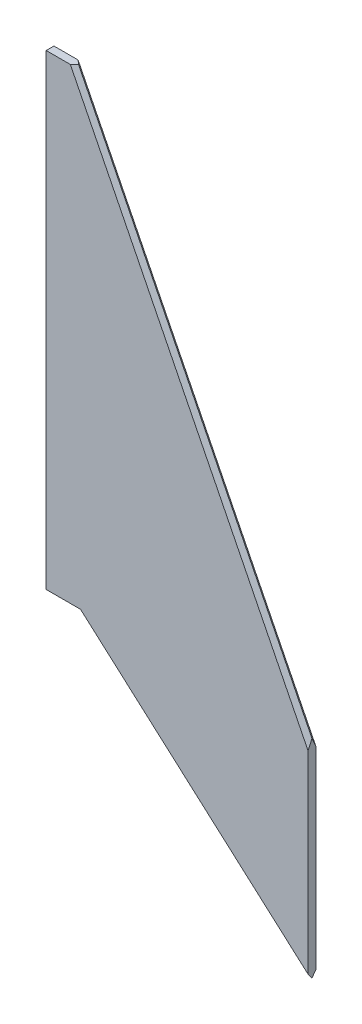
ISO-10303-21;
HEADER;
FILE_DESCRIPTION(('STEP AP214'),'2;1');
FILE_NAME('part.step','',(''),(''),'','','');
FILE_SCHEMA(('AUTOMOTIVE_DESIGN { 1 0 10303 214 1 1 1 1 }'));
ENDSEC;
DATA;
#1=APPLICATION_CONTEXT('core data for automotive mechanical design processes');
#2=APPLICATION_PROTOCOL_DEFINITION('international standard','automotive_design',2000,#1);
#3=PRODUCT_CONTEXT('',#1,'mechanical');
#4=PRODUCT('Part','Part','',(#3));
#5=PRODUCT_RELATED_PRODUCT_CATEGORY('part','',(#4));
#6=PRODUCT_DEFINITION_FORMATION('','',#4);
#7=PRODUCT_DEFINITION_CONTEXT('part definition',#1,'design');
#8=PRODUCT_DEFINITION('design','',#6,#7);
#9=PRODUCT_DEFINITION_SHAPE('','',#8);
#10=(LENGTH_UNIT() NAMED_UNIT(*) SI_UNIT(.MILLI.,.METRE.));
#11=(NAMED_UNIT(*) PLANE_ANGLE_UNIT() SI_UNIT($,.RADIAN.));
#12=(NAMED_UNIT(*) SI_UNIT($,.STERADIAN.) SOLID_ANGLE_UNIT());
#13=UNCERTAINTY_MEASURE_WITH_UNIT(LENGTH_MEASURE(1.E-05),#10,'distance_accuracy_value','');
#14=(GEOMETRIC_REPRESENTATION_CONTEXT(3) GLOBAL_UNCERTAINTY_ASSIGNED_CONTEXT((#13)) GLOBAL_UNIT_ASSIGNED_CONTEXT((#10,
#11,#12)) REPRESENTATION_CONTEXT('',''));
#15=CARTESIAN_POINT('',(0.,0.,0.));
#16=DIRECTION('',(0.,0.,1.));
#17=DIRECTION('',(1.,0.,0.));
#18=AXIS2_PLACEMENT_3D('',#15,#16,#17);
#19=CARTESIAN_POINT('',(90.,0.,1.5));
#20=DIRECTION('',(1.,0.,0.));
#21=DIRECTION('',(0.,0.,-1.));
#22=AXIS2_PLACEMENT_3D('',#19,#20,#21);
#23=PLANE('',#22);
#24=DIRECTION('',(0.,-1.,0.));
#25=VECTOR('',#24,1.);
#26=CARTESIAN_POINT('',(90.,0.,1.5));
#27=LINE('',#26,#25);
#28=CARTESIAN_POINT('',(90.,-3.35410196624959,1.5));
#29=VERTEX_POINT('',#28);
#30=CARTESIAN_POINT('',(90.,-77.9930675702013,1.5));
#31=VERTEX_POINT('',#30);
#32=EDGE_CURVE('E123',#29,#31,#27,.T.);
#33=ORIENTED_EDGE('',*,*,#32,.T.);
#34=DIRECTION('',(0.,0.800994956509706,0.598671094713962));
#35=VECTOR('',#34,1.);
#36=CARTESIAN_POINT('',(90.,-27.9532675804701,38.9002128173913));
#37=LINE('',#36,#35);
#38=CARTESIAN_POINT('',(90.,-80.,0.));
#39=VERTEX_POINT('',#38);
#40=EDGE_CURVE('E186',#31,#39,#37,.F.);
#41=ORIENTED_EDGE('',*,*,#40,.T.);
#42=DIRECTION('',(0.,0.800994956509704,-0.598671094713965));
#43=VECTOR('',#42,1.);
#44=CARTESIAN_POINT('',(90.,-29.3918651628924,-37.8249915784533));
#45=LINE('',#44,#43);
#46=CARTESIAN_POINT('',(90.,-77.9930675702012,-1.5));
#47=VERTEX_POINT('',#46);
#48=EDGE_CURVE('E183',#39,#47,#45,.T.);
#49=ORIENTED_EDGE('',*,*,#48,.T.);
#50=DIRECTION('',(0.,-1.,0.));
#51=VECTOR('',#50,1.);
#52=CARTESIAN_POINT('',(90.,0.,-1.5));
#53=LINE('',#52,#51);
#54=CARTESIAN_POINT('',(90.,-3.35410196624975,-1.5));
#55=VERTEX_POINT('',#54);
#56=EDGE_CURVE('E145',#55,#47,#53,.T.);
#57=ORIENTED_EDGE('',*,*,#56,.F.);
#58=DIRECTION('',(0.,0.91287092917528,0.408248290463857));
#59=VECTOR('',#58,1.);
#60=CARTESIAN_POINT('',(90.,0.55901699437494,0.249999999999996));
#61=LINE('',#60,#59);
#62=CARTESIAN_POINT('',(90.,0.,0.));
#63=VERTEX_POINT('',#62);
#64=EDGE_CURVE('E165',#55,#63,#61,.T.);
#65=ORIENTED_EDGE('',*,*,#64,.T.);
#66=DIRECTION('',(0.,0.912870929175276,-0.408248290463865));
#67=VECTOR('',#66,1.);
#68=CARTESIAN_POINT('',(90.,-0.559016994374941,0.250000000000021));
#69=LINE('',#68,#67);
#70=EDGE_CURVE('E162',#63,#29,#69,.F.);
#71=ORIENTED_EDGE('',*,*,#70,.T.);
#72=EDGE_LOOP('',(#33,#41,#49,#57,#65,#71));
#73=FACE_BOUND('',#72,.T.);
#74=ADVANCED_FACE('F45',(#73),#23,.T.);
#75=CARTESIAN_POINT('',(0.,180.,1.5));
#76=DIRECTION('',(0.,-1.,0.));
#77=DIRECTION('',(0.,0.,-1.));
#78=AXIS2_PLACEMENT_3D('',#75,#76,#77);
#79=PLANE('',#78);
#80=DIRECTION('',(-0.745355992499928,0.,0.666666666666669));
#81=VECTOR('',#80,1.);
#82=CARTESIAN_POINT('',(39.9999999999998,180.,-35.7770876399966));
#83=LINE('',#82,#81);
#84=CARTESIAN_POINT('',(-1.67705098312479,180.,1.5));
#85=VERTEX_POINT('',#84);
#86=CARTESIAN_POINT('',(0.,180.,0.));
#87=VERTEX_POINT('',#86);
#88=EDGE_CURVE('E168',#85,#87,#83,.F.);
#89=ORIENTED_EDGE('',*,*,#88,.T.);
#90=DIRECTION('',(-0.745355992499936,0.,-0.66666666666666));
#91=VECTOR('',#90,1.);
#92=CARTESIAN_POINT('',(38.5092880150007,180.,34.4437543066632));
#93=LINE('',#92,#91);
#94=CARTESIAN_POINT('',(-1.67705098312487,180.,-1.5));
#95=VERTEX_POINT('',#94);
#96=EDGE_CURVE('E171',#87,#95,#93,.T.);
#97=ORIENTED_EDGE('',*,*,#96,.T.);
#98=DIRECTION('',(-1.,0.,0.));
#99=VECTOR('',#98,1.);
#100=CARTESIAN_POINT('',(0.,180.,-1.5));
#101=LINE('',#100,#99);
#102=CARTESIAN_POINT('',(-11.,180.,-1.5));
#103=VERTEX_POINT('',#102);
#104=EDGE_CURVE('E129',#95,#103,#101,.T.);
#105=ORIENTED_EDGE('',*,*,#104,.T.);
#106=DIRECTION('',(0.,0.,-1.));
#107=VECTOR('',#106,1.);
#108=CARTESIAN_POINT('',(-11.,180.,1.5));
#109=LINE('',#108,#107);
#110=CARTESIAN_POINT('',(-11.,180.,1.5));
#111=VERTEX_POINT('',#110);
#112=EDGE_CURVE('E126',#111,#103,#109,.T.);
#113=ORIENTED_EDGE('',*,*,#112,.F.);
#114=DIRECTION('',(-1.,0.,0.));
#115=VECTOR('',#114,1.);
#116=CARTESIAN_POINT('',(0.,180.,1.5));
#117=LINE('',#116,#115);
#118=EDGE_CURVE('E111',#85,#111,#117,.T.);
#119=ORIENTED_EDGE('',*,*,#118,.F.);
#120=EDGE_LOOP('',(#89,#97,#105,#113,#119));
#121=FACE_BOUND('',#120,.T.);
#122=ADVANCED_FACE('F127',(#121),#79,.F.);
#123=CARTESIAN_POINT('',(-11.,0.,1.5));
#124=DIRECTION('',(-1.,0.,0.));
#125=DIRECTION('',(0.,0.,1.));
#126=AXIS2_PLACEMENT_3D('',#123,#124,#125);
#127=PLANE('',#126);
#128=DIRECTION('',(0.,1.,0.));
#129=VECTOR('',#128,1.);
#130=CARTESIAN_POINT('',(-11.,0.,-1.5));
#131=LINE('',#130,#129);
#132=CARTESIAN_POINT('',(-11.,0.,-1.5));
#133=VERTEX_POINT('',#132);
#134=EDGE_CURVE('E152',#133,#103,#131,.T.);
#135=ORIENTED_EDGE('',*,*,#134,.F.);
#136=DIRECTION('',(0.,0.,-1.));
#137=VECTOR('',#136,1.);
#138=CARTESIAN_POINT('',(-11.,0.,1.5));
#139=LINE('',#138,#137);
#140=CARTESIAN_POINT('',(-11.,0.,1.5));
#141=VERTEX_POINT('',#140);
#142=EDGE_CURVE('E135',#141,#133,#139,.T.);
#143=ORIENTED_EDGE('',*,*,#142,.F.);
#144=DIRECTION('',(0.,1.,0.));
#145=VECTOR('',#144,1.);
#146=CARTESIAN_POINT('',(-11.,0.,1.5));
#147=LINE('',#146,#145);
#148=EDGE_CURVE('E115',#141,#111,#147,.T.);
#149=ORIENTED_EDGE('',*,*,#148,.T.);
#150=ORIENTED_EDGE('',*,*,#112,.T.);
#151=EDGE_LOOP('',(#135,#143,#149,#150));
#152=FACE_BOUND('',#151,.T.);
#153=ADVANCED_FACE('F137',(#152),#127,.T.);
#154=CARTESIAN_POINT('',(0.,0.,1.5));
#155=DIRECTION('',(0.,-1.,0.));
#156=DIRECTION('',(1.,0.,0.));
#157=AXIS2_PLACEMENT_3D('',#154,#155,#156);
#158=PLANE('',#157);
#159=DIRECTION('',(-1.,0.,0.));
#160=VECTOR('',#159,1.);
#161=CARTESIAN_POINT('',(0.,0.,-1.5));
#162=LINE('',#161,#160);
#163=CARTESIAN_POINT('',(2.25779898352365,0.,-1.5));
#164=VERTEX_POINT('',#163);
#165=EDGE_CURVE('E66',#164,#133,#162,.T.);
#166=ORIENTED_EDGE('',*,*,#165,.F.);
#167=DIRECTION('',(-0.832934513816194,0.,0.55337157109286));
#168=VECTOR('',#167,1.);
#169=CARTESIAN_POINT('',(1.38276684158386,0.,-0.918660287081315));
#170=LINE('',#169,#168);
#171=CARTESIAN_POINT('',(0.,0.,0.));
#172=VERTEX_POINT('',#171);
#173=EDGE_CURVE('E11',#164,#172,#170,.T.);
#174=ORIENTED_EDGE('',*,*,#173,.T.);
#175=DIRECTION('',(-0.832934513816197,0.,-0.553371571092856));
#176=VECTOR('',#175,1.);
#177=CARTESIAN_POINT('',(0.,0.,0.));
#178=LINE('',#177,#176);
#179=CARTESIAN_POINT('',(2.25779898352356,0.,1.5));
#180=VERTEX_POINT('',#179);
#181=EDGE_CURVE('E56',#172,#180,#178,.F.);
#182=ORIENTED_EDGE('',*,*,#181,.T.);
#183=DIRECTION('',(-1.,0.,0.));
#184=VECTOR('',#183,1.);
#185=CARTESIAN_POINT('',(0.,0.,1.5));
#186=LINE('',#185,#184);
#187=EDGE_CURVE('E139',#180,#141,#186,.T.);
#188=ORIENTED_EDGE('',*,*,#187,.T.);
#189=ORIENTED_EDGE('',*,*,#142,.T.);
#190=EDGE_LOOP('',(#166,#174,#182,#188,#189));
#191=FACE_BOUND('',#190,.T.);
#192=ADVANCED_FACE('F195',(#191),#158,.T.);
#193=CARTESIAN_POINT('',(0.,0.,1.5));
#194=DIRECTION('',(0.,0.,1.));
#195=DIRECTION('',(1.,0.,0.));
#196=AXIS2_PLACEMENT_3D('',#193,#194,#195);
#197=PLANE('',#196);
#198=ORIENTED_EDGE('',*,*,#187,.F.);
#199=DIRECTION('',(0.74740931868366,-0.66436383882992,0.));
#200=VECTOR('',#199,1.);
#201=CARTESIAN_POINT('',(0.996545758244881,1.12111397802549,1.5));
#202=LINE('',#201,#200);
#203=EDGE_CURVE('E176',#180,#31,#202,.T.);
#204=ORIENTED_EDGE('',*,*,#203,.T.);
#205=ORIENTED_EDGE('',*,*,#32,.F.);
#206=DIRECTION('',(-0.447213595499958,0.894427190999916,0.));
#207=VECTOR('',#206,1.);
#208=CARTESIAN_POINT('',(70.6583592135002,35.3291796067501,1.5));
#209=LINE('',#208,#207);
#210=EDGE_CURVE('E119',#29,#85,#209,.T.);
#211=ORIENTED_EDGE('',*,*,#210,.T.);
#212=ORIENTED_EDGE('',*,*,#118,.T.);
#213=ORIENTED_EDGE('',*,*,#148,.F.);
#214=EDGE_LOOP('',(#198,#204,#205,#211,#212,#213));
#215=FACE_BOUND('',#214,.T.);
#216=ADVANCED_FACE('F113',(#215),#197,.T.);
#217=CARTESIAN_POINT('',(0.,0.,-1.5));
#218=DIRECTION('',(0.,0.,1.));
#219=DIRECTION('',(1.,0.,0.));
#220=AXIS2_PLACEMENT_3D('',#217,#218,#219);
#221=PLANE('',#220);
#222=ORIENTED_EDGE('',*,*,#56,.T.);
#223=DIRECTION('',(-0.74740931868366,0.66436383882992,0.));
#224=VECTOR('',#223,1.);
#225=CARTESIAN_POINT('',(0.996545758244922,1.12111397802554,-1.5));
#226=LINE('',#225,#224);
#227=EDGE_CURVE('E189',#47,#164,#226,.T.);
#228=ORIENTED_EDGE('',*,*,#227,.T.);
#229=ORIENTED_EDGE('',*,*,#165,.T.);
#230=ORIENTED_EDGE('',*,*,#134,.T.);
#231=ORIENTED_EDGE('',*,*,#104,.F.);
#232=DIRECTION('',(0.447213595499958,-0.894427190999916,0.));
#233=VECTOR('',#232,1.);
#234=CARTESIAN_POINT('',(88.6583592135001,-0.670820393249952,-1.5));
#235=LINE('',#234,#233);
#236=EDGE_CURVE('E134',#95,#55,#235,.T.);
#237=ORIENTED_EDGE('',*,*,#236,.T.);
#238=EDGE_LOOP('',(#222,#228,#229,#230,#231,#237));
#239=FACE_BOUND('',#238,.T.);
#240=ADVANCED_FACE('F209',(#239),#221,.F.);
#241=CARTESIAN_POINT('',(72.,36.,0.));
#242=DIRECTION('',(-0.632455532033678,-0.316227766016839,-0.707106781186546));
#243=DIRECTION('',(0.447213595499958,-0.894427190999916,0.));
#244=AXIS2_PLACEMENT_3D('',#241,#242,#243);
#245=PLANE('',#244);
#246=DIRECTION('',(0.447213595499958,-0.894427190999916,0.));
#247=VECTOR('',#246,1.);
#248=CARTESIAN_POINT('',(72.,36.,0.));
#249=LINE('',#248,#247);
#250=EDGE_CURVE('E149',#87,#63,#249,.T.);
#251=ORIENTED_EDGE('',*,*,#250,.F.);
#252=ORIENTED_EDGE('',*,*,#88,.F.);
#253=ORIENTED_EDGE('',*,*,#210,.F.);
#254=ORIENTED_EDGE('',*,*,#70,.F.);
#255=EDGE_LOOP('',(#251,#252,#253,#254));
#256=FACE_BOUND('',#255,.T.);
#257=ADVANCED_FACE('F216',(#256),#245,.F.);
#258=CARTESIAN_POINT('',(70.6583592135001,35.32917960675,-1.5));
#259=DIRECTION('',(0.63245553203367,0.316227766016835,-0.707106781186554));
#260=DIRECTION('',(-0.447213595499958,0.894427190999916,0.));
#261=AXIS2_PLACEMENT_3D('',#258,#259,#260);
#262=PLANE('',#261);
#263=ORIENTED_EDGE('',*,*,#96,.F.);
#264=ORIENTED_EDGE('',*,*,#250,.T.);
#265=ORIENTED_EDGE('',*,*,#64,.F.);
#266=ORIENTED_EDGE('',*,*,#236,.F.);
#267=EDGE_LOOP('',(#263,#264,#265,#266));
#268=FACE_BOUND('',#267,.T.);
#269=ADVANCED_FACE('F213',(#268),#262,.T.);
#270=CARTESIAN_POINT('',(0.996545758244922,1.12111397802554,-1.5));
#271=DIRECTION('',(-0.469776175611763,-0.528498197563233,-0.707106781186548));
#272=DIRECTION('',(0.74740931868366,-0.66436383882992,0.));
#273=AXIS2_PLACEMENT_3D('',#270,#271,#272);
#274=PLANE('',#273);
#275=ORIENTED_EDGE('',*,*,#227,.F.);
#276=ORIENTED_EDGE('',*,*,#48,.F.);
#277=DIRECTION('',(0.74740931868366,-0.66436383882992,0.));
#278=VECTOR('',#277,1.);
#279=CARTESIAN_POINT('',(90.,-80.,0.));
#280=LINE('',#279,#278);
#281=EDGE_CURVE('E50',#172,#39,#280,.T.);
#282=ORIENTED_EDGE('',*,*,#281,.F.);
#283=ORIENTED_EDGE('',*,*,#173,.F.);
#284=EDGE_LOOP('',(#275,#276,#282,#283));
#285=FACE_BOUND('',#284,.T.);
#286=ADVANCED_FACE('F48',(#285),#274,.T.);
#287=CARTESIAN_POINT('',(0.,0.,0.));
#288=DIRECTION('',(0.469776175611761,0.528498197563231,-0.707106781186551));
#289=DIRECTION('',(-0.74740931868366,0.66436383882992,0.));
#290=AXIS2_PLACEMENT_3D('',#287,#288,#289);
#291=PLANE('',#290);
#292=ORIENTED_EDGE('',*,*,#40,.F.);
#293=ORIENTED_EDGE('',*,*,#203,.F.);
#294=ORIENTED_EDGE('',*,*,#181,.F.);
#295=ORIENTED_EDGE('',*,*,#281,.T.);
#296=EDGE_LOOP('',(#292,#293,#294,#295));
#297=FACE_BOUND('',#296,.T.);
#298=ADVANCED_FACE('F198',(#297),#291,.F.);
#299=CLOSED_SHELL('',(#74,#122,#153,#192,#216,#240,#257,#269,#286,#298));
#300=MANIFOLD_SOLID_BREP('B2',#299);
#301=ADVANCED_BREP_SHAPE_REPRESENTATION('',(#18,#300),#14);
#302=SHAPE_DEFINITION_REPRESENTATION(#9,#301);
ENDSEC;
END-ISO-10303-21;
